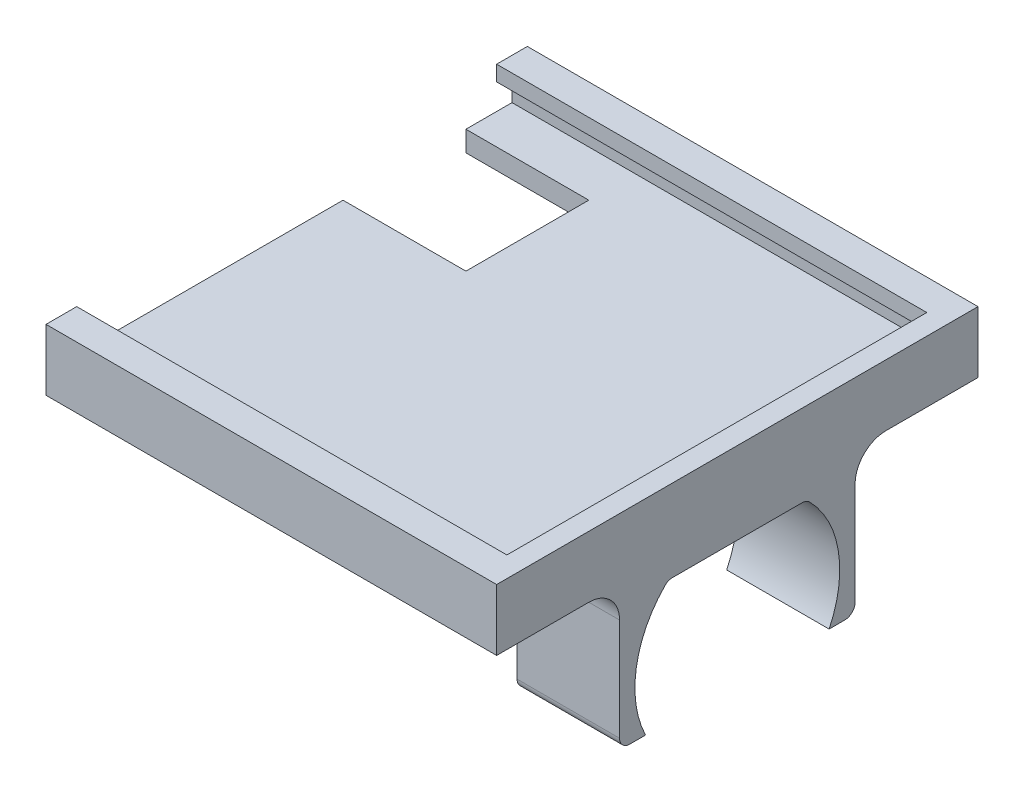
ISO-10303-21;
HEADER;
FILE_DESCRIPTION(('STEP AP214'),'2;1');
FILE_NAME('part.step','',(''),(''),'','','');
FILE_SCHEMA(('AUTOMOTIVE_DESIGN { 1 0 10303 214 1 1 1 1 }'));
ENDSEC;
DATA;
#1=APPLICATION_CONTEXT('core data for automotive mechanical design processes');
#2=APPLICATION_PROTOCOL_DEFINITION('international standard','automotive_design',2000,#1);
#3=PRODUCT_CONTEXT('',#1,'mechanical');
#4=PRODUCT('Part','Part','',(#3));
#5=PRODUCT_RELATED_PRODUCT_CATEGORY('part','',(#4));
#6=PRODUCT_DEFINITION_FORMATION('','',#4);
#7=PRODUCT_DEFINITION_CONTEXT('part definition',#1,'design');
#8=PRODUCT_DEFINITION('design','',#6,#7);
#9=PRODUCT_DEFINITION_SHAPE('','',#8);
#10=(LENGTH_UNIT() NAMED_UNIT(*) SI_UNIT(.MILLI.,.METRE.));
#11=(NAMED_UNIT(*) PLANE_ANGLE_UNIT() SI_UNIT($,.RADIAN.));
#12=(NAMED_UNIT(*) SI_UNIT($,.STERADIAN.) SOLID_ANGLE_UNIT());
#13=UNCERTAINTY_MEASURE_WITH_UNIT(LENGTH_MEASURE(1.E-05),#10,'distance_accuracy_value','');
#14=(GEOMETRIC_REPRESENTATION_CONTEXT(3) GLOBAL_UNCERTAINTY_ASSIGNED_CONTEXT((#13)) GLOBAL_UNIT_ASSIGNED_CONTEXT((#10,
#11,#12)) REPRESENTATION_CONTEXT('',''));
#15=CARTESIAN_POINT('',(0.,0.,0.));
#16=DIRECTION('',(0.,0.,1.));
#17=DIRECTION('',(1.,0.,0.));
#18=AXIS2_PLACEMENT_3D('',#15,#16,#17);
#19=CARTESIAN_POINT('',(-22.,6.,23.5));
#20=DIRECTION('',(1.,0.,0.));
#21=DIRECTION('',(0.,0.,-1.));
#22=AXIS2_PLACEMENT_3D('',#19,#20,#21);
#23=PLANE('',#22);
#24=DIRECTION('',(0.,0.,1.));
#25=VECTOR('',#24,1.);
#26=CARTESIAN_POINT('',(-22.,0.,23.5));
#27=LINE('',#26,#25);
#28=CARTESIAN_POINT('',(-22.,0.,-23.5));
#29=VERTEX_POINT('',#28);
#30=CARTESIAN_POINT('',(-22.,0.,-17.5));
#31=VERTEX_POINT('',#30);
#32=EDGE_CURVE('E383',#29,#31,#27,.T.);
#33=ORIENTED_EDGE('',*,*,#32,.T.);
#34=DIRECTION('',(0.,1.,0.));
#35=VECTOR('',#34,1.);
#36=CARTESIAN_POINT('',(-22.,6.,-17.5));
#37=LINE('',#36,#35);
#38=CARTESIAN_POINT('',(-22.,2.,-17.5));
#39=VERTEX_POINT('',#38);
#40=EDGE_CURVE('E309',#31,#39,#37,.T.);
#41=ORIENTED_EDGE('',*,*,#40,.T.);
#42=DIRECTION('',(0.,0.,-1.));
#43=VECTOR('',#42,1.);
#44=CARTESIAN_POINT('',(-22.,2.,22.));
#45=LINE('',#44,#43);
#46=CARTESIAN_POINT('',(-22.,2.,-22.));
#47=VERTEX_POINT('',#46);
#48=EDGE_CURVE('E344',#39,#47,#45,.T.);
#49=ORIENTED_EDGE('',*,*,#48,.T.);
#50=DIRECTION('',(0.,1.,0.));
#51=VECTOR('',#50,1.);
#52=CARTESIAN_POINT('',(-22.,2.,-22.));
#53=LINE('',#52,#51);
#54=CARTESIAN_POINT('',(-22.,4.5,-22.));
#55=VERTEX_POINT('',#54);
#56=EDGE_CURVE('E361',#47,#55,#53,.T.);
#57=ORIENTED_EDGE('',*,*,#56,.T.);
#58=DIRECTION('',(0.,0.,1.));
#59=VECTOR('',#58,1.);
#60=CARTESIAN_POINT('',(-22.,4.5,-20.5));
#61=LINE('',#60,#59);
#62=CARTESIAN_POINT('',(-22.,4.5,-20.5));
#63=VERTEX_POINT('',#62);
#64=EDGE_CURVE('E327',#55,#63,#61,.T.);
#65=ORIENTED_EDGE('',*,*,#64,.T.);
#66=DIRECTION('',(0.,1.,0.));
#67=VECTOR('',#66,1.);
#68=CARTESIAN_POINT('',(-22.,4.5,-20.5));
#69=LINE('',#68,#67);
#70=CARTESIAN_POINT('',(-22.,6.,-20.5));
#71=VERTEX_POINT('',#70);
#72=EDGE_CURVE('E332',#63,#71,#69,.T.);
#73=ORIENTED_EDGE('',*,*,#72,.T.);
#74=DIRECTION('',(0.,0.,1.));
#75=VECTOR('',#74,1.);
#76=CARTESIAN_POINT('',(-22.,6.,23.5));
#77=LINE('',#76,#75);
#78=CARTESIAN_POINT('',(-22.,6.,-23.5));
#79=VERTEX_POINT('',#78);
#80=EDGE_CURVE('E371',#79,#71,#77,.T.);
#81=ORIENTED_EDGE('',*,*,#80,.F.);
#82=DIRECTION('',(0.,-1.,0.));
#83=VECTOR('',#82,1.);
#84=CARTESIAN_POINT('',(-22.,6.,-23.5));
#85=LINE('',#84,#83);
#86=EDGE_CURVE('E392',#79,#29,#85,.T.);
#87=ORIENTED_EDGE('',*,*,#86,.T.);
#88=EDGE_LOOP('',(#33,#41,#49,#57,#65,#73,#81,#87));
#89=FACE_BOUND('',#88,.T.);
#90=ADVANCED_FACE('F39',(#89),#23,.F.);
#91=CARTESIAN_POINT('',(20.,2.,22.));
#92=DIRECTION('',(1.,0.,0.));
#93=DIRECTION('',(0.,0.,-1.));
#94=AXIS2_PLACEMENT_3D('',#91,#92,#93);
#95=PLANE('',#94);
#96=DIRECTION('',(0.,-1.,0.));
#97=VECTOR('',#96,1.);
#98=CARTESIAN_POINT('',(20.,2.,20.5));
#99=LINE('',#98,#97);
#100=CARTESIAN_POINT('',(20.,6.,20.5));
#101=VERTEX_POINT('',#100);
#102=CARTESIAN_POINT('',(20.,4.5,20.5));
#103=VERTEX_POINT('',#102);
#104=EDGE_CURVE('E405',#101,#103,#99,.T.);
#105=ORIENTED_EDGE('',*,*,#104,.F.);
#106=DIRECTION('',(0.,0.,-1.));
#107=VECTOR('',#106,1.);
#108=CARTESIAN_POINT('',(20.,6.,22.));
#109=LINE('',#108,#107);
#110=CARTESIAN_POINT('',(20.,6.,-20.5));
#111=VERTEX_POINT('',#110);
#112=EDGE_CURVE('E339',#101,#111,#109,.T.);
#113=ORIENTED_EDGE('',*,*,#112,.T.);
#114=DIRECTION('',(0.,-1.,0.));
#115=VECTOR('',#114,1.);
#116=CARTESIAN_POINT('',(20.,2.,-20.5));
#117=LINE('',#116,#115);
#118=CARTESIAN_POINT('',(20.,4.5,-20.5));
#119=VERTEX_POINT('',#118);
#120=EDGE_CURVE('E400',#111,#119,#117,.T.);
#121=ORIENTED_EDGE('',*,*,#120,.T.);
#122=DIRECTION('',(0.,0.,1.));
#123=VECTOR('',#122,1.);
#124=CARTESIAN_POINT('',(20.,4.5,22.));
#125=LINE('',#124,#123);
#126=CARTESIAN_POINT('',(20.,4.5,-22.));
#127=VERTEX_POINT('',#126);
#128=EDGE_CURVE('E397',#127,#119,#125,.T.);
#129=ORIENTED_EDGE('',*,*,#128,.F.);
#130=DIRECTION('',(0.,1.,0.));
#131=VECTOR('',#130,1.);
#132=CARTESIAN_POINT('',(20.,2.,-22.));
#133=LINE('',#132,#131);
#134=CARTESIAN_POINT('',(20.,2.,-22.));
#135=VERTEX_POINT('',#134);
#136=EDGE_CURVE('E358',#135,#127,#133,.T.);
#137=ORIENTED_EDGE('',*,*,#136,.F.);
#138=DIRECTION('',(0.,0.,-1.));
#139=VECTOR('',#138,1.);
#140=CARTESIAN_POINT('',(20.,2.,22.));
#141=LINE('',#140,#139);
#142=CARTESIAN_POINT('',(20.,2.,22.));
#143=VERTEX_POINT('',#142);
#144=EDGE_CURVE('E346',#143,#135,#141,.T.);
#145=ORIENTED_EDGE('',*,*,#144,.F.);
#146=DIRECTION('',(0.,1.,0.));
#147=VECTOR('',#146,1.);
#148=CARTESIAN_POINT('',(20.,2.,22.));
#149=LINE('',#148,#147);
#150=CARTESIAN_POINT('',(20.,4.5,22.));
#151=VERTEX_POINT('',#150);
#152=EDGE_CURVE('E355',#143,#151,#149,.T.);
#153=ORIENTED_EDGE('',*,*,#152,.T.);
#154=DIRECTION('',(0.,0.,1.));
#155=VECTOR('',#154,1.);
#156=CARTESIAN_POINT('',(20.,4.5,22.));
#157=LINE('',#156,#155);
#158=EDGE_CURVE('E323',#103,#151,#157,.T.);
#159=ORIENTED_EDGE('',*,*,#158,.F.);
#160=EDGE_LOOP('',(#105,#113,#121,#129,#137,#145,#153,#159));
#161=FACE_BOUND('',#160,.T.);
#162=ADVANCED_FACE('F492',(#161),#95,.F.);
#163=CARTESIAN_POINT('',(-22.,2.,22.));
#164=DIRECTION('',(0.,0.,1.));
#165=DIRECTION('',(1.,0.,0.));
#166=AXIS2_PLACEMENT_3D('',#163,#164,#165);
#167=PLANE('',#166);
#168=DIRECTION('',(-1.,0.,0.));
#169=VECTOR('',#168,1.);
#170=CARTESIAN_POINT('',(-22.,4.5,22.));
#171=LINE('',#170,#169);
#172=CARTESIAN_POINT('',(-22.,4.5,22.));
#173=VERTEX_POINT('',#172);
#174=EDGE_CURVE('E402',#151,#173,#171,.T.);
#175=ORIENTED_EDGE('',*,*,#174,.F.);
#176=ORIENTED_EDGE('',*,*,#152,.F.);
#177=DIRECTION('',(1.,0.,0.));
#178=VECTOR('',#177,1.);
#179=CARTESIAN_POINT('',(-22.,2.,22.));
#180=LINE('',#179,#178);
#181=CARTESIAN_POINT('',(-22.,2.,22.));
#182=VERTEX_POINT('',#181);
#183=EDGE_CURVE('E349',#182,#143,#180,.T.);
#184=ORIENTED_EDGE('',*,*,#183,.F.);
#185=DIRECTION('',(0.,1.,0.));
#186=VECTOR('',#185,1.);
#187=CARTESIAN_POINT('',(-22.,2.,22.));
#188=LINE('',#187,#186);
#189=EDGE_CURVE('E352',#182,#173,#188,.T.);
#190=ORIENTED_EDGE('',*,*,#189,.T.);
#191=EDGE_LOOP('',(#175,#176,#184,#190));
#192=FACE_BOUND('',#191,.T.);
#193=ADVANCED_FACE('F501',(#192),#167,.F.);
#194=CARTESIAN_POINT('',(-22.,2.,-22.));
#195=DIRECTION('',(0.,0.,1.));
#196=DIRECTION('',(1.,0.,0.));
#197=AXIS2_PLACEMENT_3D('',#194,#195,#196);
#198=PLANE('',#197);
#199=ORIENTED_EDGE('',*,*,#136,.T.);
#200=DIRECTION('',(-1.,0.,0.));
#201=VECTOR('',#200,1.);
#202=CARTESIAN_POINT('',(-22.,4.5,-22.));
#203=LINE('',#202,#201);
#204=EDGE_CURVE('E337',#127,#55,#203,.T.);
#205=ORIENTED_EDGE('',*,*,#204,.T.);
#206=ORIENTED_EDGE('',*,*,#56,.F.);
#207=DIRECTION('',(1.,0.,0.));
#208=VECTOR('',#207,1.);
#209=CARTESIAN_POINT('',(-22.,2.,-22.));
#210=LINE('',#209,#208);
#211=EDGE_CURVE('E343',#47,#135,#210,.T.);
#212=ORIENTED_EDGE('',*,*,#211,.T.);
#213=EDGE_LOOP('',(#199,#205,#206,#212));
#214=FACE_BOUND('',#213,.T.);
#215=ADVANCED_FACE('F507',(#214),#198,.T.);
#216=CARTESIAN_POINT('',(-22.,2.,-5.5));
#217=VERTEX_POINT('',#216);
#218=EDGE_CURVE('E340',#182,#217,#45,.T.);
#219=ORIENTED_EDGE('',*,*,#218,.T.);
#220=DIRECTION('',(0.,-1.,0.));
#221=VECTOR('',#220,1.);
#222=CARTESIAN_POINT('',(-22.,6.,-5.5));
#223=LINE('',#222,#221);
#224=CARTESIAN_POINT('',(-22.,0.,-5.5));
#225=VERTEX_POINT('',#224);
#226=EDGE_CURVE('E296',#217,#225,#223,.T.);
#227=ORIENTED_EDGE('',*,*,#226,.T.);
#228=CARTESIAN_POINT('',(-22.,0.,23.5));
#229=VERTEX_POINT('',#228);
#230=EDGE_CURVE('E382',#225,#229,#27,.T.);
#231=ORIENTED_EDGE('',*,*,#230,.T.);
#232=DIRECTION('',(0.,-1.,0.));
#233=VECTOR('',#232,1.);
#234=CARTESIAN_POINT('',(-22.,6.,23.5));
#235=LINE('',#234,#233);
#236=CARTESIAN_POINT('',(-22.,6.,23.5));
#237=VERTEX_POINT('',#236);
#238=EDGE_CURVE('E389',#237,#229,#235,.T.);
#239=ORIENTED_EDGE('',*,*,#238,.F.);
#240=CARTESIAN_POINT('',(-22.,6.,20.5));
#241=VERTEX_POINT('',#240);
#242=EDGE_CURVE('E370',#241,#237,#77,.T.);
#243=ORIENTED_EDGE('',*,*,#242,.F.);
#244=DIRECTION('',(0.,1.,0.));
#245=VECTOR('',#244,1.);
#246=CARTESIAN_POINT('',(-22.,4.5,20.5));
#247=LINE('',#246,#245);
#248=CARTESIAN_POINT('',(-22.,4.5,20.5));
#249=VERTEX_POINT('',#248);
#250=EDGE_CURVE('E318',#249,#241,#247,.T.);
#251=ORIENTED_EDGE('',*,*,#250,.F.);
#252=DIRECTION('',(0.,0.,-1.));
#253=VECTOR('',#252,1.);
#254=CARTESIAN_POINT('',(-22.,4.5,20.5));
#255=LINE('',#254,#253);
#256=EDGE_CURVE('E313',#173,#249,#255,.T.);
#257=ORIENTED_EDGE('',*,*,#256,.F.);
#258=ORIENTED_EDGE('',*,*,#189,.F.);
#259=EDGE_LOOP('',(#219,#227,#231,#239,#243,#251,#257,#258));
#260=FACE_BOUND('',#259,.T.);
#261=ADVANCED_FACE('F495',(#260),#23,.F.);
#262=CARTESIAN_POINT('',(0.,6.,0.));
#263=DIRECTION('',(0.,-1.,0.));
#264=DIRECTION('',(0.,0.,-1.));
#265=AXIS2_PLACEMENT_3D('',#262,#263,#264);
#266=PLANE('',#265);
#267=DIRECTION('',(0.,0.,-1.));
#268=VECTOR('',#267,1.);
#269=CARTESIAN_POINT('',(22.,6.,23.5));
#270=LINE('',#269,#268);
#271=CARTESIAN_POINT('',(22.,6.,23.5));
#272=VERTEX_POINT('',#271);
#273=CARTESIAN_POINT('',(22.,6.,-23.5));
#274=VERTEX_POINT('',#273);
#275=EDGE_CURVE('E365',#272,#274,#270,.T.);
#276=ORIENTED_EDGE('',*,*,#275,.T.);
#277=DIRECTION('',(-1.,0.,0.));
#278=VECTOR('',#277,1.);
#279=CARTESIAN_POINT('',(-22.,6.,-23.5));
#280=LINE('',#279,#278);
#281=EDGE_CURVE('E367',#274,#79,#280,.T.);
#282=ORIENTED_EDGE('',*,*,#281,.T.);
#283=ORIENTED_EDGE('',*,*,#80,.T.);
#284=DIRECTION('',(1.,0.,0.));
#285=VECTOR('',#284,1.);
#286=CARTESIAN_POINT('',(22.,6.,-20.5));
#287=LINE('',#286,#285);
#288=EDGE_CURVE('E326',#71,#111,#287,.T.);
#289=ORIENTED_EDGE('',*,*,#288,.T.);
#290=ORIENTED_EDGE('',*,*,#112,.F.);
#291=DIRECTION('',(1.,0.,0.));
#292=VECTOR('',#291,1.);
#293=CARTESIAN_POINT('',(22.,6.,20.5));
#294=LINE('',#293,#292);
#295=EDGE_CURVE('E312',#241,#101,#294,.T.);
#296=ORIENTED_EDGE('',*,*,#295,.F.);
#297=ORIENTED_EDGE('',*,*,#242,.T.);
#298=DIRECTION('',(1.,0.,0.));
#299=VECTOR('',#298,1.);
#300=CARTESIAN_POINT('',(-22.,6.,23.5));
#301=LINE('',#300,#299);
#302=EDGE_CURVE('E373',#237,#272,#301,.T.);
#303=ORIENTED_EDGE('',*,*,#302,.T.);
#304=EDGE_LOOP('',(#276,#282,#283,#289,#290,#296,#297,#303));
#305=FACE_BOUND('',#304,.T.);
#306=ADVANCED_FACE('F506',(#305),#266,.F.);
#307=CARTESIAN_POINT('',(22.,6.,23.5));
#308=DIRECTION('',(-1.,0.,0.));
#309=DIRECTION('',(0.,0.,1.));
#310=AXIS2_PLACEMENT_3D('',#307,#308,#309);
#311=PLANE('',#310);
#312=DIRECTION('',(0.,-1.,0.));
#313=VECTOR('',#312,1.);
#314=CARTESIAN_POINT('',(22.,6.,11.5));
#315=LINE('',#314,#313);
#316=CARTESIAN_POINT('',(22.,-3.,11.5));
#317=VERTEX_POINT('',#316);
#318=CARTESIAN_POINT('',(22.,-13.,11.5));
#319=VERTEX_POINT('',#318);
#320=EDGE_CURVE('E282',#317,#319,#315,.T.);
#321=ORIENTED_EDGE('',*,*,#320,.T.);
#322=CARTESIAN_POINT('',(22.,-13.,10.5));
#323=DIRECTION('',(-1.,0.,0.));
#324=DIRECTION('',(0.,0.,1.));
#325=AXIS2_PLACEMENT_3D('',#322,#323,#324);
#326=CIRCLE('',#325,1.);
#327=CARTESIAN_POINT('',(22.,-14.,10.5));
#328=VERTEX_POINT('',#327);
#329=EDGE_CURVE('E446',#319,#328,#326,.F.);
#330=ORIENTED_EDGE('',*,*,#329,.T.);
#331=DIRECTION('',(0.,0.,-1.));
#332=VECTOR('',#331,1.);
#333=CARTESIAN_POINT('',(22.,-14.,23.5));
#334=LINE('',#333,#332);
#335=CARTESIAN_POINT('',(22.,-14.,8.96261900349973));
#336=VERTEX_POINT('',#335);
#337=EDGE_CURVE('E285',#328,#336,#334,.T.);
#338=ORIENTED_EDGE('',*,*,#337,.T.);
#339=CARTESIAN_POINT('',(22.,-9.5,-0.278846153846154));
#340=DIRECTION('',(-1.,0.,0.));
#341=DIRECTION('',(0.,0.,1.));
#342=AXIS2_PLACEMENT_3D('',#339,#340,#341);
#343=CIRCLE('',#342,10.2788461538462);
#344=CARTESIAN_POINT('',(22.,-2.29948186528497,7.05649411406766));
#345=VERTEX_POINT('',#344);
#346=EDGE_CURVE('E271',#336,#345,#343,.T.);
#347=ORIENTED_EDGE('',*,*,#346,.T.);
#348=CARTESIAN_POINT('',(22.,-3.,6.34285951363451));
#349=DIRECTION('',(-1.,0.,0.));
#350=DIRECTION('',(0.,0.,1.));
#351=AXIS2_PLACEMENT_3D('',#348,#349,#350);
#352=CIRCLE('',#351,1.);
#353=CARTESIAN_POINT('',(22.,-2.,6.34285951363451));
#354=VERTEX_POINT('',#353);
#355=EDGE_CURVE('E47',#345,#354,#352,.T.);
#356=ORIENTED_EDGE('',*,*,#355,.T.);
#357=DIRECTION('',(0.,0.,-1.));
#358=VECTOR('',#357,1.);
#359=CARTESIAN_POINT('',(22.,-2.,23.5));
#360=LINE('',#359,#358);
#361=CARTESIAN_POINT('',(22.,-2.,-6.34285951363451));
#362=VERTEX_POINT('',#361);
#363=EDGE_CURVE('E274',#354,#362,#360,.T.);
#364=ORIENTED_EDGE('',*,*,#363,.T.);
#365=CARTESIAN_POINT('',(22.,-3.,-6.34285951363451));
#366=DIRECTION('',(-1.,0.,0.));
#367=DIRECTION('',(0.,0.,1.));
#368=AXIS2_PLACEMENT_3D('',#365,#366,#367);
#369=CIRCLE('',#368,1.);
#370=CARTESIAN_POINT('',(22.,-2.29948186528497,-7.05649411406766));
#371=VERTEX_POINT('',#370);
#372=EDGE_CURVE('E456',#362,#371,#369,.T.);
#373=ORIENTED_EDGE('',*,*,#372,.T.);
#374=CARTESIAN_POINT('',(22.,-9.5,0.278846153846154));
#375=DIRECTION('',(-1.,0.,0.));
#376=DIRECTION('',(0.,0.,1.));
#377=AXIS2_PLACEMENT_3D('',#374,#375,#376);
#378=CIRCLE('',#377,10.2788461538462);
#379=CARTESIAN_POINT('',(22.,-14.,-8.96261900349973));
#380=VERTEX_POINT('',#379);
#381=EDGE_CURVE('E277',#371,#380,#378,.T.);
#382=ORIENTED_EDGE('',*,*,#381,.T.);
#383=DIRECTION('',(0.,0.,-1.));
#384=VECTOR('',#383,1.);
#385=CARTESIAN_POINT('',(22.,-14.,23.5));
#386=LINE('',#385,#384);
#387=CARTESIAN_POINT('',(22.,-14.,-10.5));
#388=VERTEX_POINT('',#387);
#389=EDGE_CURVE('E254',#380,#388,#386,.T.);
#390=ORIENTED_EDGE('',*,*,#389,.T.);
#391=CARTESIAN_POINT('',(22.,-13.,-10.5));
#392=DIRECTION('',(-1.,0.,0.));
#393=DIRECTION('',(0.,0.,1.));
#394=AXIS2_PLACEMENT_3D('',#391,#392,#393);
#395=CIRCLE('',#394,1.);
#396=CARTESIAN_POINT('',(22.,-13.,-11.5));
#397=VERTEX_POINT('',#396);
#398=EDGE_CURVE('E444',#388,#397,#395,.F.);
#399=ORIENTED_EDGE('',*,*,#398,.T.);
#400=DIRECTION('',(0.,1.,0.));
#401=VECTOR('',#400,1.);
#402=CARTESIAN_POINT('',(22.,6.,-11.5));
#403=LINE('',#402,#401);
#404=CARTESIAN_POINT('',(22.,-3.,-11.5));
#405=VERTEX_POINT('',#404);
#406=EDGE_CURVE('E280',#397,#405,#403,.T.);
#407=ORIENTED_EDGE('',*,*,#406,.T.);
#408=CARTESIAN_POINT('',(22.,-3.,-14.5));
#409=DIRECTION('',(-1.,0.,0.));
#410=DIRECTION('',(0.,0.,1.));
#411=AXIS2_PLACEMENT_3D('',#408,#409,#410);
#412=CIRCLE('',#411,3.);
#413=CARTESIAN_POINT('',(22.,0.,-14.5));
#414=VERTEX_POINT('',#413);
#415=EDGE_CURVE('E427',#405,#414,#412,.T.);
#416=ORIENTED_EDGE('',*,*,#415,.T.);
#417=DIRECTION('',(0.,0.,-1.));
#418=VECTOR('',#417,1.);
#419=CARTESIAN_POINT('',(22.,0.,23.5));
#420=LINE('',#419,#418);
#421=CARTESIAN_POINT('',(22.,0.,-23.5));
#422=VERTEX_POINT('',#421);
#423=EDGE_CURVE('E364',#414,#422,#420,.T.);
#424=ORIENTED_EDGE('',*,*,#423,.T.);
#425=DIRECTION('',(0.,-1.,0.));
#426=VECTOR('',#425,1.);
#427=CARTESIAN_POINT('',(22.,6.,-23.5));
#428=LINE('',#427,#426);
#429=EDGE_CURVE('E394',#274,#422,#428,.T.);
#430=ORIENTED_EDGE('',*,*,#429,.F.);
#431=ORIENTED_EDGE('',*,*,#275,.F.);
#432=DIRECTION('',(0.,-1.,0.));
#433=VECTOR('',#432,1.);
#434=CARTESIAN_POINT('',(22.,6.,23.5));
#435=LINE('',#434,#433);
#436=CARTESIAN_POINT('',(22.,0.,23.5));
#437=VERTEX_POINT('',#436);
#438=EDGE_CURVE('E375',#272,#437,#435,.T.);
#439=ORIENTED_EDGE('',*,*,#438,.T.);
#440=CARTESIAN_POINT('',(22.,0.,14.5));
#441=VERTEX_POINT('',#440);
#442=EDGE_CURVE('E376',#437,#441,#420,.T.);
#443=ORIENTED_EDGE('',*,*,#442,.T.);
#444=CARTESIAN_POINT('',(22.,-3.,14.5));
#445=DIRECTION('',(-1.,0.,0.));
#446=DIRECTION('',(0.,0.,1.));
#447=AXIS2_PLACEMENT_3D('',#444,#445,#446);
#448=CIRCLE('',#447,3.);
#449=EDGE_CURVE('E422',#441,#317,#448,.T.);
#450=ORIENTED_EDGE('',*,*,#449,.T.);
#451=EDGE_LOOP('',(#321,#330,#338,#347,#356,#364,#373,#382,#390,#399,#407,#416,#424,#430,#431,
#439,#443,#450));
#452=FACE_BOUND('',#451,.T.);
#453=ADVANCED_FACE('F461',(#452),#311,.F.);
#454=CARTESIAN_POINT('',(-22.,6.,-23.5));
#455=DIRECTION('',(0.,0.,1.));
#456=DIRECTION('',(1.,0.,0.));
#457=AXIS2_PLACEMENT_3D('',#454,#455,#456);
#458=PLANE('',#457);
#459=ORIENTED_EDGE('',*,*,#429,.T.);
#460=DIRECTION('',(-1.,0.,0.));
#461=VECTOR('',#460,1.);
#462=CARTESIAN_POINT('',(-22.,0.,-23.5));
#463=LINE('',#462,#461);
#464=EDGE_CURVE('E379',#422,#29,#463,.T.);
#465=ORIENTED_EDGE('',*,*,#464,.T.);
#466=ORIENTED_EDGE('',*,*,#86,.F.);
#467=ORIENTED_EDGE('',*,*,#281,.F.);
#468=EDGE_LOOP('',(#459,#465,#466,#467));
#469=FACE_BOUND('',#468,.T.);
#470=ADVANCED_FACE('F549',(#469),#458,.F.);
#471=CARTESIAN_POINT('',(-22.,6.,23.5));
#472=DIRECTION('',(0.,0.,-1.));
#473=DIRECTION('',(-1.,0.,0.));
#474=AXIS2_PLACEMENT_3D('',#471,#472,#473);
#475=PLANE('',#474);
#476=ORIENTED_EDGE('',*,*,#238,.T.);
#477=DIRECTION('',(1.,0.,0.));
#478=VECTOR('',#477,1.);
#479=CARTESIAN_POINT('',(-22.,0.,23.5));
#480=LINE('',#479,#478);
#481=EDGE_CURVE('E368',#229,#437,#480,.T.);
#482=ORIENTED_EDGE('',*,*,#481,.T.);
#483=ORIENTED_EDGE('',*,*,#438,.F.);
#484=ORIENTED_EDGE('',*,*,#302,.F.);
#485=EDGE_LOOP('',(#476,#482,#483,#484));
#486=FACE_BOUND('',#485,.T.);
#487=ADVANCED_FACE('F571',(#486),#475,.F.);
#488=CARTESIAN_POINT('',(0.,0.,0.));
#489=DIRECTION('',(0.,-1.,0.));
#490=DIRECTION('',(0.,0.,-1.));
#491=AXIS2_PLACEMENT_3D('',#488,#489,#490);
#492=PLANE('',#491);
#493=DIRECTION('',(0.,0.,1.));
#494=VECTOR('',#493,1.);
#495=CARTESIAN_POINT('',(12.,0.,23.5));
#496=LINE('',#495,#494);
#497=CARTESIAN_POINT('',(12.,0.,-14.5));
#498=VERTEX_POINT('',#497);
#499=CARTESIAN_POINT('',(12.,0.,14.5));
#500=VERTEX_POINT('',#499);
#501=EDGE_CURVE('E262',#498,#500,#496,.T.);
#502=ORIENTED_EDGE('',*,*,#501,.T.);
#503=DIRECTION('',(1.,0.,0.));
#504=VECTOR('',#503,1.);
#505=CARTESIAN_POINT('',(22.,0.,14.5));
#506=LINE('',#505,#504);
#507=EDGE_CURVE('E414',#500,#441,#506,.T.);
#508=ORIENTED_EDGE('',*,*,#507,.T.);
#509=ORIENTED_EDGE('',*,*,#442,.F.);
#510=ORIENTED_EDGE('',*,*,#481,.F.);
#511=ORIENTED_EDGE('',*,*,#230,.F.);
#512=DIRECTION('',(-1.,0.,0.));
#513=VECTOR('',#512,1.);
#514=CARTESIAN_POINT('',(-34.,0.,-5.5));
#515=LINE('',#514,#513);
#516=CARTESIAN_POINT('',(-9.99999999999999,0.,-5.5));
#517=VERTEX_POINT('',#516);
#518=EDGE_CURVE('E299',#517,#225,#515,.T.);
#519=ORIENTED_EDGE('',*,*,#518,.F.);
#520=DIRECTION('',(0.,0.,1.));
#521=VECTOR('',#520,1.);
#522=CARTESIAN_POINT('',(-9.99999999999999,0.,-17.5));
#523=LINE('',#522,#521);
#524=CARTESIAN_POINT('',(-9.99999999999999,0.,-17.5));
#525=VERTEX_POINT('',#524);
#526=EDGE_CURVE('E289',#525,#517,#523,.T.);
#527=ORIENTED_EDGE('',*,*,#526,.F.);
#528=DIRECTION('',(1.,0.,0.));
#529=VECTOR('',#528,1.);
#530=CARTESIAN_POINT('',(-34.,0.,-17.5));
#531=LINE('',#530,#529);
#532=EDGE_CURVE('E301',#31,#525,#531,.T.);
#533=ORIENTED_EDGE('',*,*,#532,.F.);
#534=ORIENTED_EDGE('',*,*,#32,.F.);
#535=ORIENTED_EDGE('',*,*,#464,.F.);
#536=ORIENTED_EDGE('',*,*,#423,.F.);
#537=DIRECTION('',(1.,0.,0.));
#538=VECTOR('',#537,1.);
#539=CARTESIAN_POINT('',(12.,0.,-14.5));
#540=LINE('',#539,#538);
#541=EDGE_CURVE('E411',#414,#498,#540,.F.);
#542=ORIENTED_EDGE('',*,*,#541,.T.);
#543=EDGE_LOOP('',(#502,#508,#509,#510,#511,#519,#527,#533,#534,#535,#536,#542));
#544=FACE_BOUND('',#543,.T.);
#545=ADVANCED_FACE('F555',(#544),#492,.T.);
#546=CARTESIAN_POINT('',(0.,2.,0.));
#547=DIRECTION('',(0.,-1.,0.));
#548=DIRECTION('',(0.,0.,-1.));
#549=AXIS2_PLACEMENT_3D('',#546,#547,#548);
#550=PLANE('',#549);
#551=ORIENTED_EDGE('',*,*,#48,.F.);
#552=DIRECTION('',(-1.,0.,0.));
#553=VECTOR('',#552,1.);
#554=CARTESIAN_POINT('',(-34.,2.,-17.5));
#555=LINE('',#554,#553);
#556=CARTESIAN_POINT('',(-9.99999999999999,2.,-17.5));
#557=VERTEX_POINT('',#556);
#558=EDGE_CURVE('E291',#557,#39,#555,.T.);
#559=ORIENTED_EDGE('',*,*,#558,.F.);
#560=DIRECTION('',(0.,0.,-1.));
#561=VECTOR('',#560,1.);
#562=CARTESIAN_POINT('',(-9.99999999999999,2.,-17.5));
#563=LINE('',#562,#561);
#564=CARTESIAN_POINT('',(-9.99999999999999,2.,-5.5));
#565=VERTEX_POINT('',#564);
#566=EDGE_CURVE('E293',#565,#557,#563,.T.);
#567=ORIENTED_EDGE('',*,*,#566,.F.);
#568=DIRECTION('',(-1.,0.,0.));
#569=VECTOR('',#568,1.);
#570=CARTESIAN_POINT('',(0.,2.,-5.5));
#571=LINE('',#570,#569);
#572=EDGE_CURVE('E408',#565,#217,#571,.T.);
#573=ORIENTED_EDGE('',*,*,#572,.T.);
#574=ORIENTED_EDGE('',*,*,#218,.F.);
#575=ORIENTED_EDGE('',*,*,#183,.T.);
#576=ORIENTED_EDGE('',*,*,#144,.T.);
#577=ORIENTED_EDGE('',*,*,#211,.F.);
#578=EDGE_LOOP('',(#551,#559,#567,#573,#574,#575,#576,#577));
#579=FACE_BOUND('',#578,.T.);
#580=ADVANCED_FACE('F524',(#579),#550,.F.);
#581=CARTESIAN_POINT('',(22.,4.5,-20.5));
#582=DIRECTION('',(0.,0.,1.));
#583=DIRECTION('',(1.,0.,0.));
#584=AXIS2_PLACEMENT_3D('',#581,#582,#583);
#585=PLANE('',#584);
#586=ORIENTED_EDGE('',*,*,#120,.F.);
#587=ORIENTED_EDGE('',*,*,#288,.F.);
#588=ORIENTED_EDGE('',*,*,#72,.F.);
#589=DIRECTION('',(1.,0.,0.));
#590=VECTOR('',#589,1.);
#591=CARTESIAN_POINT('',(22.,4.5,-20.5));
#592=LINE('',#591,#590);
#593=EDGE_CURVE('E329',#63,#119,#592,.T.);
#594=ORIENTED_EDGE('',*,*,#593,.T.);
#595=EDGE_LOOP('',(#586,#587,#588,#594));
#596=FACE_BOUND('',#595,.T.);
#597=ADVANCED_FACE('F540',(#596),#585,.T.);
#598=CARTESIAN_POINT('',(0.,4.5,0.));
#599=DIRECTION('',(0.,1.,0.));
#600=DIRECTION('',(0.,0.,1.));
#601=AXIS2_PLACEMENT_3D('',#598,#599,#600);
#602=PLANE('',#601);
#603=ORIENTED_EDGE('',*,*,#204,.F.);
#604=ORIENTED_EDGE('',*,*,#128,.T.);
#605=ORIENTED_EDGE('',*,*,#593,.F.);
#606=ORIENTED_EDGE('',*,*,#64,.F.);
#607=EDGE_LOOP('',(#603,#604,#605,#606));
#608=FACE_BOUND('',#607,.T.);
#609=ADVANCED_FACE('F537',(#608),#602,.F.);
#610=CARTESIAN_POINT('',(22.,4.5,20.5));
#611=DIRECTION('',(0.,0.,1.));
#612=DIRECTION('',(1.,0.,0.));
#613=AXIS2_PLACEMENT_3D('',#610,#611,#612);
#614=PLANE('',#613);
#615=ORIENTED_EDGE('',*,*,#295,.T.);
#616=ORIENTED_EDGE('',*,*,#104,.T.);
#617=DIRECTION('',(1.,0.,0.));
#618=VECTOR('',#617,1.);
#619=CARTESIAN_POINT('',(22.,4.5,20.5));
#620=LINE('',#619,#618);
#621=EDGE_CURVE('E315',#249,#103,#620,.T.);
#622=ORIENTED_EDGE('',*,*,#621,.F.);
#623=ORIENTED_EDGE('',*,*,#250,.T.);
#624=EDGE_LOOP('',(#615,#616,#622,#623));
#625=FACE_BOUND('',#624,.T.);
#626=ADVANCED_FACE('F577',(#625),#614,.F.);
#627=CARTESIAN_POINT('',(0.,4.5,0.));
#628=DIRECTION('',(0.,1.,0.));
#629=DIRECTION('',(0.,0.,-1.));
#630=AXIS2_PLACEMENT_3D('',#627,#628,#629);
#631=PLANE('',#630);
#632=ORIENTED_EDGE('',*,*,#621,.T.);
#633=ORIENTED_EDGE('',*,*,#158,.T.);
#634=ORIENTED_EDGE('',*,*,#174,.T.);
#635=ORIENTED_EDGE('',*,*,#256,.T.);
#636=EDGE_LOOP('',(#632,#633,#634,#635));
#637=FACE_BOUND('',#636,.T.);
#638=ADVANCED_FACE('F579',(#637),#631,.F.);
#639=CARTESIAN_POINT('',(-34.,28.8328157299975,-17.5));
#640=DIRECTION('',(0.,0.,-1.));
#641=DIRECTION('',(-1.,0.,0.));
#642=AXIS2_PLACEMENT_3D('',#639,#640,#641);
#643=PLANE('',#642);
#644=ORIENTED_EDGE('',*,*,#532,.T.);
#645=DIRECTION('',(0.,-1.,0.));
#646=VECTOR('',#645,1.);
#647=CARTESIAN_POINT('',(-9.99999999999999,28.8328157299975,-17.5));
#648=LINE('',#647,#646);
#649=EDGE_CURVE('E294',#557,#525,#648,.T.);
#650=ORIENTED_EDGE('',*,*,#649,.F.);
#651=ORIENTED_EDGE('',*,*,#558,.T.);
#652=ORIENTED_EDGE('',*,*,#40,.F.);
#653=EDGE_LOOP('',(#644,#650,#651,#652));
#654=FACE_BOUND('',#653,.T.);
#655=ADVANCED_FACE('F558',(#654),#643,.F.);
#656=CARTESIAN_POINT('',(-34.,28.8328157299975,-5.5));
#657=DIRECTION('',(0.,0.,1.));
#658=DIRECTION('',(1.,0.,0.));
#659=AXIS2_PLACEMENT_3D('',#656,#657,#658);
#660=PLANE('',#659);
#661=ORIENTED_EDGE('',*,*,#572,.F.);
#662=DIRECTION('',(0.,-1.,0.));
#663=VECTOR('',#662,1.);
#664=CARTESIAN_POINT('',(-9.99999999999999,28.8328157299975,-5.5));
#665=LINE('',#664,#663);
#666=EDGE_CURVE('E303',#565,#517,#665,.T.);
#667=ORIENTED_EDGE('',*,*,#666,.T.);
#668=ORIENTED_EDGE('',*,*,#518,.T.);
#669=ORIENTED_EDGE('',*,*,#226,.F.);
#670=EDGE_LOOP('',(#661,#667,#668,#669));
#671=FACE_BOUND('',#670,.T.);
#672=ADVANCED_FACE('F565',(#671),#660,.F.);
#673=CARTESIAN_POINT('',(-9.99999999999999,28.8328157299975,-17.5));
#674=DIRECTION('',(1.,0.,0.));
#675=DIRECTION('',(0.,0.,-1.));
#676=AXIS2_PLACEMENT_3D('',#673,#674,#675);
#677=PLANE('',#676);
#678=ORIENTED_EDGE('',*,*,#566,.T.);
#679=ORIENTED_EDGE('',*,*,#649,.T.);
#680=ORIENTED_EDGE('',*,*,#526,.T.);
#681=ORIENTED_EDGE('',*,*,#666,.F.);
#682=EDGE_LOOP('',(#678,#679,#680,#681));
#683=FACE_BOUND('',#682,.T.);
#684=ADVANCED_FACE('F562',(#683),#677,.F.);
#685=CARTESIAN_POINT('',(12.,-9.5,-0.278846153846154));
#686=DIRECTION('',(1.,0.,0.));
#687=DIRECTION('',(0.,0.,-1.));
#688=AXIS2_PLACEMENT_3D('',#685,#686,#687);
#689=CYLINDRICAL_SURFACE('',#688,10.2788461538462);
#690=CARTESIAN_POINT('',(12.,-9.5,-0.278846153846154));
#691=DIRECTION('',(-1.,0.,0.));
#692=DIRECTION('',(0.,0.,1.));
#693=AXIS2_PLACEMENT_3D('',#690,#691,#692);
#694=CIRCLE('',#693,10.2788461538462);
#695=CARTESIAN_POINT('',(12.,-14.,8.96261900349973));
#696=VERTEX_POINT('',#695);
#697=CARTESIAN_POINT('',(12.,-2.29948186528497,7.05649411406766));
#698=VERTEX_POINT('',#697);
#699=EDGE_CURVE('E287',#696,#698,#694,.T.);
#700=ORIENTED_EDGE('',*,*,#699,.T.);
#701=DIRECTION('',(1.,0.,0.));
#702=VECTOR('',#701,1.);
#703=CARTESIAN_POINT('',(12.,-2.29948186528497,7.05649411406766));
#704=LINE('',#703,#702);
#705=EDGE_CURVE('E438',#698,#345,#704,.T.);
#706=ORIENTED_EDGE('',*,*,#705,.T.);
#707=ORIENTED_EDGE('',*,*,#346,.F.);
#708=DIRECTION('',(1.,0.,0.));
#709=VECTOR('',#708,1.);
#710=CARTESIAN_POINT('',(12.,-14.,8.96261900349973));
#711=LINE('',#710,#709);
#712=EDGE_CURVE('E255',#696,#336,#711,.T.);
#713=ORIENTED_EDGE('',*,*,#712,.F.);
#714=EDGE_LOOP('',(#700,#706,#707,#713));
#715=FACE_BOUND('',#714,.T.);
#716=ADVANCED_FACE('F477',(#715),#689,.F.);
#717=CARTESIAN_POINT('',(12.,-14.,23.5));
#718=DIRECTION('',(0.,-1.,0.));
#719=DIRECTION('',(0.,0.,-1.));
#720=AXIS2_PLACEMENT_3D('',#717,#718,#719);
#721=PLANE('',#720);
#722=ORIENTED_EDGE('',*,*,#337,.F.);
#723=DIRECTION('',(1.,0.,0.));
#724=VECTOR('',#723,1.);
#725=CARTESIAN_POINT('',(12.,-14.,10.5));
#726=LINE('',#725,#724);
#727=CARTESIAN_POINT('',(12.,-14.,10.5));
#728=VERTEX_POINT('',#727);
#729=EDGE_CURVE('E448',#328,#728,#726,.F.);
#730=ORIENTED_EDGE('',*,*,#729,.T.);
#731=DIRECTION('',(0.,0.,-1.));
#732=VECTOR('',#731,1.);
#733=CARTESIAN_POINT('',(12.,-14.,23.5));
#734=LINE('',#733,#732);
#735=EDGE_CURVE('E256',#728,#696,#734,.T.);
#736=ORIENTED_EDGE('',*,*,#735,.T.);
#737=ORIENTED_EDGE('',*,*,#712,.T.);
#738=EDGE_LOOP('',(#722,#730,#736,#737));
#739=FACE_BOUND('',#738,.T.);
#740=ADVANCED_FACE('F691',(#739),#721,.T.);
#741=CARTESIAN_POINT('',(12.,6.,11.5));
#742=DIRECTION('',(0.,0.,1.));
#743=DIRECTION('',(0.,-1.,0.));
#744=AXIS2_PLACEMENT_3D('',#741,#742,#743);
#745=PLANE('',#744);
#746=DIRECTION('',(0.,-1.,0.));
#747=VECTOR('',#746,1.);
#748=CARTESIAN_POINT('',(12.,6.,11.5));
#749=LINE('',#748,#747);
#750=CARTESIAN_POINT('',(12.,-3.,11.5));
#751=VERTEX_POINT('',#750);
#752=CARTESIAN_POINT('',(12.,-13.,11.5));
#753=VERTEX_POINT('',#752);
#754=EDGE_CURVE('E267',#751,#753,#749,.T.);
#755=ORIENTED_EDGE('',*,*,#754,.T.);
#756=DIRECTION('',(1.,0.,0.));
#757=VECTOR('',#756,1.);
#758=CARTESIAN_POINT('',(12.,-13.,11.5));
#759=LINE('',#758,#757);
#760=EDGE_CURVE('E441',#753,#319,#759,.T.);
#761=ORIENTED_EDGE('',*,*,#760,.T.);
#762=ORIENTED_EDGE('',*,*,#320,.F.);
#763=DIRECTION('',(1.,0.,0.));
#764=VECTOR('',#763,1.);
#765=CARTESIAN_POINT('',(12.,-3.,11.5));
#766=LINE('',#765,#764);
#767=EDGE_CURVE('E417',#317,#751,#766,.F.);
#768=ORIENTED_EDGE('',*,*,#767,.T.);
#769=EDGE_LOOP('',(#755,#761,#762,#768));
#770=FACE_BOUND('',#769,.T.);
#771=ADVANCED_FACE('F683',(#770),#745,.T.);
#772=CARTESIAN_POINT('',(12.,6.,-11.5));
#773=DIRECTION('',(0.,0.,-1.));
#774=DIRECTION('',(0.,1.,0.));
#775=AXIS2_PLACEMENT_3D('',#772,#773,#774);
#776=PLANE('',#775);
#777=ORIENTED_EDGE('',*,*,#406,.F.);
#778=DIRECTION('',(1.,0.,0.));
#779=VECTOR('',#778,1.);
#780=CARTESIAN_POINT('',(12.,-13.,-11.5));
#781=LINE('',#780,#779);
#782=CARTESIAN_POINT('',(12.,-13.,-11.5));
#783=VERTEX_POINT('',#782);
#784=EDGE_CURVE('E62',#397,#783,#781,.F.);
#785=ORIENTED_EDGE('',*,*,#784,.T.);
#786=DIRECTION('',(0.,1.,0.));
#787=VECTOR('',#786,1.);
#788=CARTESIAN_POINT('',(12.,6.,-11.5));
#789=LINE('',#788,#787);
#790=CARTESIAN_POINT('',(12.,-3.,-11.5));
#791=VERTEX_POINT('',#790);
#792=EDGE_CURVE('E260',#783,#791,#789,.T.);
#793=ORIENTED_EDGE('',*,*,#792,.T.);
#794=DIRECTION('',(1.,0.,0.));
#795=VECTOR('',#794,1.);
#796=CARTESIAN_POINT('',(22.,-3.,-11.5));
#797=LINE('',#796,#795);
#798=EDGE_CURVE('E419',#791,#405,#797,.T.);
#799=ORIENTED_EDGE('',*,*,#798,.T.);
#800=EDGE_LOOP('',(#777,#785,#793,#799));
#801=FACE_BOUND('',#800,.T.);
#802=ADVANCED_FACE('F483',(#801),#776,.T.);
#803=CARTESIAN_POINT('',(12.,-14.,23.5));
#804=DIRECTION('',(0.,-1.,0.));
#805=DIRECTION('',(0.,0.,-1.));
#806=AXIS2_PLACEMENT_3D('',#803,#804,#805);
#807=PLANE('',#806);
#808=DIRECTION('',(0.,0.,-1.));
#809=VECTOR('',#808,1.);
#810=CARTESIAN_POINT('',(12.,-14.,23.5));
#811=LINE('',#810,#809);
#812=CARTESIAN_POINT('',(12.,-14.,-8.96261900349973));
#813=VERTEX_POINT('',#812);
#814=CARTESIAN_POINT('',(12.,-14.,-10.5));
#815=VERTEX_POINT('',#814);
#816=EDGE_CURVE('E246',#813,#815,#811,.T.);
#817=ORIENTED_EDGE('',*,*,#816,.T.);
#818=DIRECTION('',(1.,0.,0.));
#819=VECTOR('',#818,1.);
#820=CARTESIAN_POINT('',(12.,-14.,-10.5));
#821=LINE('',#820,#819);
#822=EDGE_CURVE('E453',#815,#388,#821,.T.);
#823=ORIENTED_EDGE('',*,*,#822,.T.);
#824=ORIENTED_EDGE('',*,*,#389,.F.);
#825=DIRECTION('',(1.,0.,0.));
#826=VECTOR('',#825,1.);
#827=CARTESIAN_POINT('',(12.,-14.,-8.96261900349973));
#828=LINE('',#827,#826);
#829=EDGE_CURVE('E241',#813,#380,#828,.T.);
#830=ORIENTED_EDGE('',*,*,#829,.F.);
#831=EDGE_LOOP('',(#817,#823,#824,#830));
#832=FACE_BOUND('',#831,.T.);
#833=ADVANCED_FACE('F250',(#832),#807,.T.);
#834=CARTESIAN_POINT('',(12.,-9.5,0.278846153846154));
#835=DIRECTION('',(1.,0.,0.));
#836=DIRECTION('',(0.,0.,-1.));
#837=AXIS2_PLACEMENT_3D('',#834,#835,#836);
#838=CYLINDRICAL_SURFACE('',#837,10.2788461538462);
#839=ORIENTED_EDGE('',*,*,#381,.F.);
#840=DIRECTION('',(1.,0.,0.));
#841=VECTOR('',#840,1.);
#842=CARTESIAN_POINT('',(12.,-2.29948186528497,-7.05649411406766));
#843=LINE('',#842,#841);
#844=CARTESIAN_POINT('',(12.,-2.29948186528497,-7.05649411406766));
#845=VERTEX_POINT('',#844);
#846=EDGE_CURVE('E244',#371,#845,#843,.F.);
#847=ORIENTED_EDGE('',*,*,#846,.T.);
#848=CARTESIAN_POINT('',(12.,-9.5,0.278846153846154));
#849=DIRECTION('',(-1.,0.,0.));
#850=DIRECTION('',(0.,0.,1.));
#851=AXIS2_PLACEMENT_3D('',#848,#849,#850);
#852=CIRCLE('',#851,10.2788461538462);
#853=EDGE_CURVE('E237',#845,#813,#852,.T.);
#854=ORIENTED_EDGE('',*,*,#853,.T.);
#855=ORIENTED_EDGE('',*,*,#829,.T.);
#856=EDGE_LOOP('',(#839,#847,#854,#855));
#857=FACE_BOUND('',#856,.T.);
#858=ADVANCED_FACE('F240',(#857),#838,.F.);
#859=CARTESIAN_POINT('',(12.,-2.,23.5));
#860=DIRECTION('',(0.,-1.,0.));
#861=DIRECTION('',(0.,0.,-1.));
#862=AXIS2_PLACEMENT_3D('',#859,#860,#861);
#863=PLANE('',#862);
#864=DIRECTION('',(0.,0.,-1.));
#865=VECTOR('',#864,1.);
#866=CARTESIAN_POINT('',(12.,-2.,23.5));
#867=LINE('',#866,#865);
#868=CARTESIAN_POINT('',(12.,-2.,6.34285951363451));
#869=VERTEX_POINT('',#868);
#870=CARTESIAN_POINT('',(12.,-2.,-6.34285951363451));
#871=VERTEX_POINT('',#870);
#872=EDGE_CURVE('E247',#869,#871,#867,.T.);
#873=ORIENTED_EDGE('',*,*,#872,.T.);
#874=DIRECTION('',(-1.,0.,0.));
#875=VECTOR('',#874,1.);
#876=CARTESIAN_POINT('',(22.,-2.,-6.34285951363451));
#877=LINE('',#876,#875);
#878=EDGE_CURVE('E434',#871,#362,#877,.F.);
#879=ORIENTED_EDGE('',*,*,#878,.T.);
#880=ORIENTED_EDGE('',*,*,#363,.F.);
#881=DIRECTION('',(-1.,0.,0.));
#882=VECTOR('',#881,1.);
#883=CARTESIAN_POINT('',(12.,-2.,6.34285951363451));
#884=LINE('',#883,#882);
#885=EDGE_CURVE('E432',#354,#869,#884,.T.);
#886=ORIENTED_EDGE('',*,*,#885,.T.);
#887=EDGE_LOOP('',(#873,#879,#880,#886));
#888=FACE_BOUND('',#887,.T.);
#889=ADVANCED_FACE('F468',(#888),#863,.T.);
#890=CARTESIAN_POINT('',(12.,-9.5,-0.278846153846154));
#891=DIRECTION('',(-1.,0.,0.));
#892=DIRECTION('',(0.,0.,1.));
#893=AXIS2_PLACEMENT_3D('',#890,#891,#892);
#894=PLANE('',#893);
#895=ORIENTED_EDGE('',*,*,#735,.F.);
#896=CARTESIAN_POINT('',(12.,-13.,10.5));
#897=DIRECTION('',(-1.,0.,0.));
#898=DIRECTION('',(0.,0.,1.));
#899=AXIS2_PLACEMENT_3D('',#896,#897,#898);
#900=CIRCLE('',#899,1.);
#901=EDGE_CURVE('E451',#728,#753,#900,.T.);
#902=ORIENTED_EDGE('',*,*,#901,.T.);
#903=ORIENTED_EDGE('',*,*,#754,.F.);
#904=CARTESIAN_POINT('',(12.,-3.,14.5));
#905=DIRECTION('',(-1.,0.,0.));
#906=DIRECTION('',(0.,0.,1.));
#907=AXIS2_PLACEMENT_3D('',#904,#905,#906);
#908=CIRCLE('',#907,3.);
#909=EDGE_CURVE('E424',#751,#500,#908,.F.);
#910=ORIENTED_EDGE('',*,*,#909,.T.);
#911=ORIENTED_EDGE('',*,*,#501,.F.);
#912=CARTESIAN_POINT('',(12.,-3.,-14.5));
#913=DIRECTION('',(-1.,0.,0.));
#914=DIRECTION('',(0.,0.,1.));
#915=AXIS2_PLACEMENT_3D('',#912,#913,#914);
#916=CIRCLE('',#915,3.);
#917=EDGE_CURVE('E429',#498,#791,#916,.F.);
#918=ORIENTED_EDGE('',*,*,#917,.T.);
#919=ORIENTED_EDGE('',*,*,#792,.F.);
#920=CARTESIAN_POINT('',(12.,-13.,-10.5));
#921=DIRECTION('',(-1.,0.,0.));
#922=DIRECTION('',(0.,0.,1.));
#923=AXIS2_PLACEMENT_3D('',#920,#921,#922);
#924=CIRCLE('',#923,1.);
#925=EDGE_CURVE('E54',#783,#815,#924,.T.);
#926=ORIENTED_EDGE('',*,*,#925,.T.);
#927=ORIENTED_EDGE('',*,*,#816,.F.);
#928=ORIENTED_EDGE('',*,*,#853,.F.);
#929=CARTESIAN_POINT('',(12.,-3.,-6.34285951363451));
#930=DIRECTION('',(-1.,0.,0.));
#931=DIRECTION('',(0.,0.,1.));
#932=AXIS2_PLACEMENT_3D('',#929,#930,#931);
#933=CIRCLE('',#932,1.);
#934=EDGE_CURVE('E458',#845,#871,#933,.F.);
#935=ORIENTED_EDGE('',*,*,#934,.T.);
#936=ORIENTED_EDGE('',*,*,#872,.F.);
#937=CARTESIAN_POINT('',(12.,-3.,6.34285951363451));
#938=DIRECTION('',(-1.,0.,0.));
#939=DIRECTION('',(0.,0.,1.));
#940=AXIS2_PLACEMENT_3D('',#937,#938,#939);
#941=CIRCLE('',#940,1.);
#942=EDGE_CURVE('E11',#869,#698,#941,.F.);
#943=ORIENTED_EDGE('',*,*,#942,.T.);
#944=ORIENTED_EDGE('',*,*,#699,.F.);
#945=EDGE_LOOP('',(#895,#902,#903,#910,#911,#918,#919,#926,#927,#928,#935,#936,#943,#944));
#946=FACE_BOUND('',#945,.T.);
#947=ADVANCED_FACE('F259',(#946),#894,.T.);
#948=CARTESIAN_POINT('',(0.,-3.,14.5));
#949=DIRECTION('',(-1.,0.,0.));
#950=DIRECTION('',(0.,0.,1.));
#951=AXIS2_PLACEMENT_3D('',#948,#949,#950);
#952=CYLINDRICAL_SURFACE('',#951,3.);
#953=ORIENTED_EDGE('',*,*,#909,.F.);
#954=ORIENTED_EDGE('',*,*,#767,.F.);
#955=ORIENTED_EDGE('',*,*,#449,.F.);
#956=ORIENTED_EDGE('',*,*,#507,.F.);
#957=EDGE_LOOP('',(#953,#954,#955,#956));
#958=FACE_BOUND('',#957,.T.);
#959=ADVANCED_FACE('F607',(#958),#952,.F.);
#960=CARTESIAN_POINT('',(12.,-3.,-14.5));
#961=DIRECTION('',(-1.,0.,0.));
#962=DIRECTION('',(0.,0.,1.));
#963=AXIS2_PLACEMENT_3D('',#960,#961,#962);
#964=CYLINDRICAL_SURFACE('',#963,3.);
#965=ORIENTED_EDGE('',*,*,#917,.F.);
#966=ORIENTED_EDGE('',*,*,#541,.F.);
#967=ORIENTED_EDGE('',*,*,#415,.F.);
#968=ORIENTED_EDGE('',*,*,#798,.F.);
#969=EDGE_LOOP('',(#965,#966,#967,#968));
#970=FACE_BOUND('',#969,.T.);
#971=ADVANCED_FACE('F610',(#970),#964,.F.);
#972=CARTESIAN_POINT('',(12.,-3.,-6.34285951363451));
#973=DIRECTION('',(1.,0.,0.));
#974=DIRECTION('',(0.,0.,-1.));
#975=AXIS2_PLACEMENT_3D('',#972,#973,#974);
#976=CYLINDRICAL_SURFACE('',#975,1.);
#977=ORIENTED_EDGE('',*,*,#934,.F.);
#978=ORIENTED_EDGE('',*,*,#846,.F.);
#979=ORIENTED_EDGE('',*,*,#372,.F.);
#980=ORIENTED_EDGE('',*,*,#878,.F.);
#981=EDGE_LOOP('',(#977,#978,#979,#980));
#982=FACE_BOUND('',#981,.T.);
#983=ADVANCED_FACE('F480',(#982),#976,.F.);
#984=CARTESIAN_POINT('',(12.,-3.,6.34285951363451));
#985=DIRECTION('',(1.,0.,0.));
#986=DIRECTION('',(0.,0.,-1.));
#987=AXIS2_PLACEMENT_3D('',#984,#985,#986);
#988=CYLINDRICAL_SURFACE('',#987,1.);
#989=ORIENTED_EDGE('',*,*,#942,.F.);
#990=ORIENTED_EDGE('',*,*,#885,.F.);
#991=ORIENTED_EDGE('',*,*,#355,.F.);
#992=ORIENTED_EDGE('',*,*,#705,.F.);
#993=EDGE_LOOP('',(#989,#990,#991,#992));
#994=FACE_BOUND('',#993,.T.);
#995=ADVANCED_FACE('F472',(#994),#988,.F.);
#996=CARTESIAN_POINT('',(12.,-13.,10.5));
#997=DIRECTION('',(1.,0.,0.));
#998=DIRECTION('',(0.,0.,-1.));
#999=AXIS2_PLACEMENT_3D('',#996,#997,#998);
#1000=CYLINDRICAL_SURFACE('',#999,1.);
#1001=ORIENTED_EDGE('',*,*,#901,.F.);
#1002=ORIENTED_EDGE('',*,*,#729,.F.);
#1003=ORIENTED_EDGE('',*,*,#329,.F.);
#1004=ORIENTED_EDGE('',*,*,#760,.F.);
#1005=EDGE_LOOP('',(#1001,#1002,#1003,#1004));
#1006=FACE_BOUND('',#1005,.T.);
#1007=ADVANCED_FACE('F486',(#1006),#1000,.T.);
#1008=CARTESIAN_POINT('',(12.,-13.,-10.5));
#1009=DIRECTION('',(1.,0.,0.));
#1010=DIRECTION('',(0.,0.,-1.));
#1011=AXIS2_PLACEMENT_3D('',#1008,#1009,#1010);
#1012=CYLINDRICAL_SURFACE('',#1011,1.);
#1013=ORIENTED_EDGE('',*,*,#925,.F.);
#1014=ORIENTED_EDGE('',*,*,#784,.F.);
#1015=ORIENTED_EDGE('',*,*,#398,.F.);
#1016=ORIENTED_EDGE('',*,*,#822,.F.);
#1017=EDGE_LOOP('',(#1013,#1014,#1015,#1016));
#1018=FACE_BOUND('',#1017,.T.);
#1019=ADVANCED_FACE('F41',(#1018),#1012,.T.);
#1020=CLOSED_SHELL('',(#90,#162,#193,#215,#261,#306,#453,#470,#487,#545,#580,#597,#609,#626,
#638,#655,#672,#684,#716,#740,#771,#802,#833,#858,#889,#947,#959,#971,#983,#995,#1007,#1019));
#1021=MANIFOLD_SOLID_BREP('B2',#1020);
#1022=ADVANCED_BREP_SHAPE_REPRESENTATION('',(#18,#1021),#14);
#1023=SHAPE_DEFINITION_REPRESENTATION(#9,#1022);
ENDSEC;
END-ISO-10303-21;
